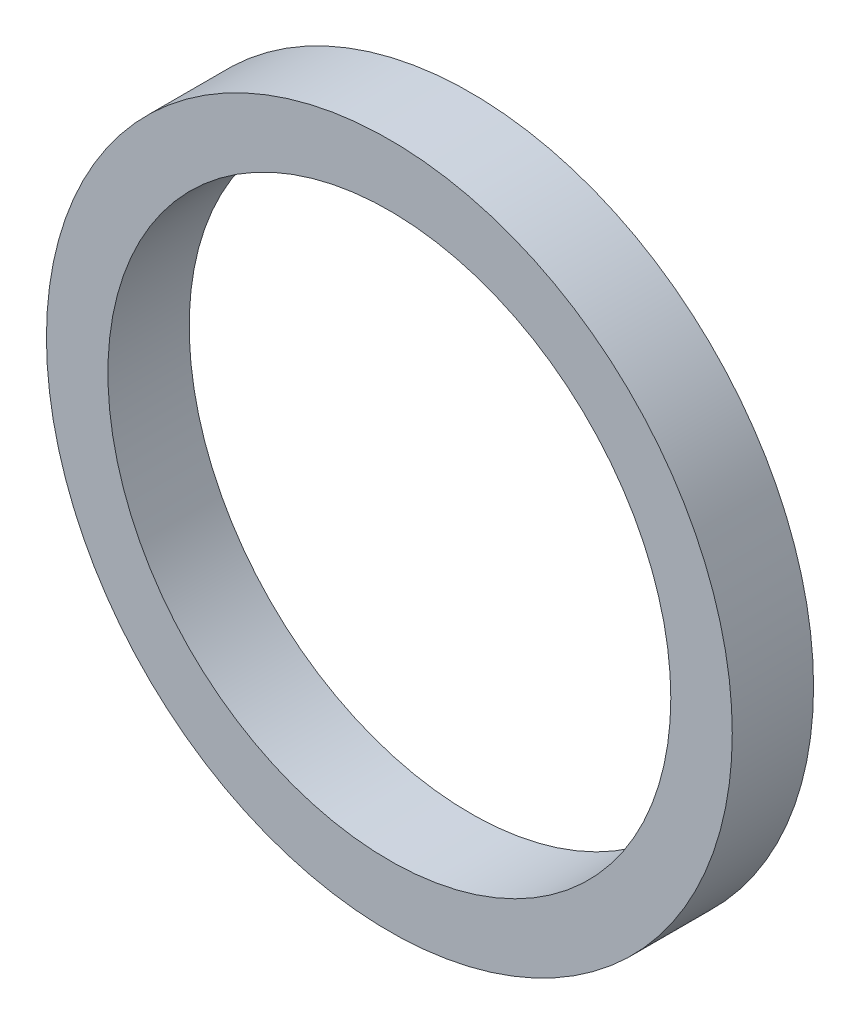
ISO-10303-21;
HEADER;
FILE_DESCRIPTION(('STEP AP214'),'2;1');
FILE_NAME('part.step','',(''),(''),'','','');
FILE_SCHEMA(('AUTOMOTIVE_DESIGN { 1 0 10303 214 1 1 1 1 }'));
ENDSEC;
DATA;
#1=APPLICATION_CONTEXT('core data for automotive mechanical design processes');
#2=APPLICATION_PROTOCOL_DEFINITION('international standard','automotive_design',2000,#1);
#3=PRODUCT_CONTEXT('',#1,'mechanical');
#4=PRODUCT('Part','Part','',(#3));
#5=PRODUCT_RELATED_PRODUCT_CATEGORY('part','',(#4));
#6=PRODUCT_DEFINITION_FORMATION('','',#4);
#7=PRODUCT_DEFINITION_CONTEXT('part definition',#1,'design');
#8=PRODUCT_DEFINITION('design','',#6,#7);
#9=PRODUCT_DEFINITION_SHAPE('','',#8);
#10=(LENGTH_UNIT() NAMED_UNIT(*) SI_UNIT(.MILLI.,.METRE.));
#11=(NAMED_UNIT(*) PLANE_ANGLE_UNIT() SI_UNIT($,.RADIAN.));
#12=(NAMED_UNIT(*) SI_UNIT($,.STERADIAN.) SOLID_ANGLE_UNIT());
#13=UNCERTAINTY_MEASURE_WITH_UNIT(LENGTH_MEASURE(1.E-05),#10,'distance_accuracy_value','');
#14=(GEOMETRIC_REPRESENTATION_CONTEXT(3) GLOBAL_UNCERTAINTY_ASSIGNED_CONTEXT((#13)) GLOBAL_UNIT_ASSIGNED_CONTEXT((#10,
#11,#12)) REPRESENTATION_CONTEXT('',''));
#15=CARTESIAN_POINT('',(0.,0.,0.));
#16=DIRECTION('',(0.,0.,1.));
#17=DIRECTION('',(1.,0.,0.));
#18=AXIS2_PLACEMENT_3D('',#15,#16,#17);
#19=CARTESIAN_POINT('',(0.,0.,1.6));
#20=DIRECTION('',(0.,0.,1.));
#21=DIRECTION('',(1.,0.,0.));
#22=AXIS2_PLACEMENT_3D('',#19,#20,#21);
#23=PLANE('',#22);
#24=CARTESIAN_POINT('',(0.,0.,1.6));
#25=DIRECTION('',(0.,0.,1.));
#26=DIRECTION('',(1.,0.,0.));
#27=AXIS2_PLACEMENT_3D('',#24,#25,#26);
#28=CIRCLE('',#27,6.75);
#29=CARTESIAN_POINT('',(6.75,0.,1.6));
#30=VERTEX_POINT('',#29);
#31=EDGE_CURVE('E10',#30,#30,#28,.T.);
#32=ORIENTED_EDGE('',*,*,#31,.T.);
#33=EDGE_LOOP('',(#32));
#34=FACE_BOUND('',#33,.T.);
#35=CARTESIAN_POINT('',(0.,0.,1.6));
#36=DIRECTION('',(0.,0.,1.));
#37=DIRECTION('',(1.,0.,0.));
#38=AXIS2_PLACEMENT_3D('',#35,#36,#37);
#39=CIRCLE('',#38,5.54);
#40=CARTESIAN_POINT('',(5.54,0.,1.6));
#41=VERTEX_POINT('',#40);
#42=EDGE_CURVE('E50',#41,#41,#39,.T.);
#43=ORIENTED_EDGE('',*,*,#42,.F.);
#44=EDGE_LOOP('',(#43));
#45=FACE_BOUND('',#44,.T.);
#46=ADVANCED_FACE('F37',(#34,#45),#23,.T.);
#47=CARTESIAN_POINT('',(0.,0.,0.));
#48=DIRECTION('',(0.,0.,1.));
#49=DIRECTION('',(1.,0.,0.));
#50=AXIS2_PLACEMENT_3D('',#47,#48,#49);
#51=PLANE('',#50);
#52=CARTESIAN_POINT('',(0.,0.,0.));
#53=DIRECTION('',(0.,0.,1.));
#54=DIRECTION('',(1.,0.,0.));
#55=AXIS2_PLACEMENT_3D('',#52,#53,#54);
#56=CIRCLE('',#55,6.75);
#57=CARTESIAN_POINT('',(6.75,0.,0.));
#58=VERTEX_POINT('',#57);
#59=EDGE_CURVE('E41',#58,#58,#56,.T.);
#60=ORIENTED_EDGE('',*,*,#59,.F.);
#61=EDGE_LOOP('',(#60));
#62=FACE_BOUND('',#61,.T.);
#63=CARTESIAN_POINT('',(0.,0.,0.));
#64=DIRECTION('',(0.,0.,1.));
#65=DIRECTION('',(1.,0.,0.));
#66=AXIS2_PLACEMENT_3D('',#63,#64,#65);
#67=CIRCLE('',#66,5.54);
#68=CARTESIAN_POINT('',(5.54,0.,0.));
#69=VERTEX_POINT('',#68);
#70=EDGE_CURVE('E52',#69,#69,#67,.T.);
#71=ORIENTED_EDGE('',*,*,#70,.T.);
#72=EDGE_LOOP('',(#71));
#73=FACE_BOUND('',#72,.T.);
#74=ADVANCED_FACE('F64',(#62,#73),#51,.F.);
#75=CARTESIAN_POINT('',(0.,0.,1.6));
#76=DIRECTION('',(0.,0.,-1.));
#77=DIRECTION('',(-1.,0.,0.));
#78=AXIS2_PLACEMENT_3D('',#75,#76,#77);
#79=CYLINDRICAL_SURFACE('',#78,6.75);
#80=ORIENTED_EDGE('',*,*,#31,.F.);
#81=EDGE_LOOP('',(#80));
#82=FACE_BOUND('',#81,.T.);
#83=ORIENTED_EDGE('',*,*,#59,.T.);
#84=EDGE_LOOP('',(#83));
#85=FACE_BOUND('',#84,.T.);
#86=ADVANCED_FACE('F39',(#82,#85),#79,.T.);
#87=CARTESIAN_POINT('',(0.,0.,1.6));
#88=DIRECTION('',(0.,0.,-1.));
#89=DIRECTION('',(-1.,0.,0.));
#90=AXIS2_PLACEMENT_3D('',#87,#88,#89);
#91=CYLINDRICAL_SURFACE('',#90,5.54);
#92=ORIENTED_EDGE('',*,*,#42,.T.);
#93=EDGE_LOOP('',(#92));
#94=FACE_BOUND('',#93,.T.);
#95=ORIENTED_EDGE('',*,*,#70,.F.);
#96=EDGE_LOOP('',(#95));
#97=FACE_BOUND('',#96,.T.);
#98=ADVANCED_FACE('F60',(#94,#97),#91,.F.);
#99=CLOSED_SHELL('',(#46,#74,#86,#98));
#100=MANIFOLD_SOLID_BREP('B2',#99);
#101=ADVANCED_BREP_SHAPE_REPRESENTATION('',(#18,#100),#14);
#102=SHAPE_DEFINITION_REPRESENTATION(#9,#101);
ENDSEC;
END-ISO-10303-21;
